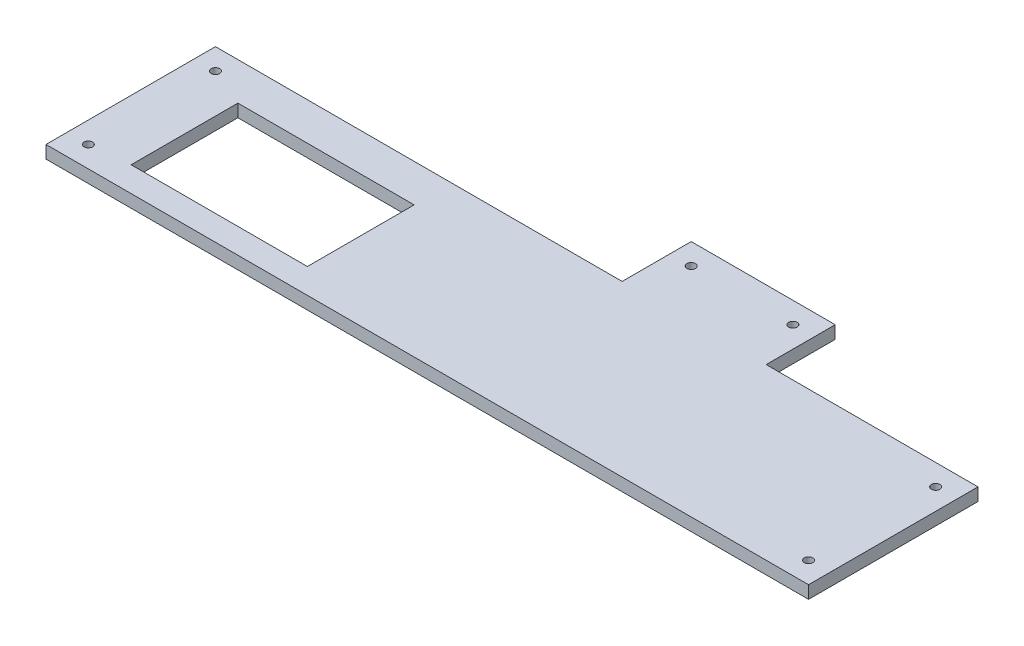
ISO-10303-21;
HEADER;
FILE_DESCRIPTION(('STEP AP214'),'2;1');
FILE_NAME('part.step','',(''),(''),'','','');
FILE_SCHEMA(('AUTOMOTIVE_DESIGN { 1 0 10303 214 1 1 1 1 }'));
ENDSEC;
DATA;
#1=APPLICATION_CONTEXT('core data for automotive mechanical design processes');
#2=APPLICATION_PROTOCOL_DEFINITION('international standard','automotive_design',2000,#1);
#3=PRODUCT_CONTEXT('',#1,'mechanical');
#4=PRODUCT('Part','Part','',(#3));
#5=PRODUCT_RELATED_PRODUCT_CATEGORY('part','',(#4));
#6=PRODUCT_DEFINITION_FORMATION('','',#4);
#7=PRODUCT_DEFINITION_CONTEXT('part definition',#1,'design');
#8=PRODUCT_DEFINITION('design','',#6,#7);
#9=PRODUCT_DEFINITION_SHAPE('','',#8);
#10=(LENGTH_UNIT() NAMED_UNIT(*) SI_UNIT(.MILLI.,.METRE.));
#11=(NAMED_UNIT(*) PLANE_ANGLE_UNIT() SI_UNIT($,.RADIAN.));
#12=(NAMED_UNIT(*) SI_UNIT($,.STERADIAN.) SOLID_ANGLE_UNIT());
#13=UNCERTAINTY_MEASURE_WITH_UNIT(LENGTH_MEASURE(1.E-05),#10,'distance_accuracy_value','');
#14=(GEOMETRIC_REPRESENTATION_CONTEXT(3) GLOBAL_UNCERTAINTY_ASSIGNED_CONTEXT((#13)) GLOBAL_UNIT_ASSIGNED_CONTEXT((#10,
#11,#12)) REPRESENTATION_CONTEXT('',''));
#15=CARTESIAN_POINT('',(0.,0.,0.));
#16=DIRECTION('',(0.,0.,1.));
#17=DIRECTION('',(1.,0.,0.));
#18=AXIS2_PLACEMENT_3D('',#15,#16,#17);
#19=CARTESIAN_POINT('',(450.,-15.,-100.000000000001));
#20=DIRECTION('',(0.,0.,-1.));
#21=DIRECTION('',(-1.,0.,0.));
#22=AXIS2_PLACEMENT_3D('',#19,#20,#21);
#23=PLANE('',#22);
#24=DIRECTION('',(-1.,0.,0.));
#25=VECTOR('',#24,1.);
#26=CARTESIAN_POINT('',(450.,-15.,-100.000000000001));
#27=LINE('',#26,#25);
#28=CARTESIAN_POINT('',(450.,-15.,-100.000000000001));
#29=VERTEX_POINT('',#28);
#30=CARTESIAN_POINT('',(200.,-15.,-100.000000000001));
#31=VERTEX_POINT('',#30);
#32=EDGE_CURVE('E224',#29,#31,#27,.T.);
#33=ORIENTED_EDGE('',*,*,#32,.T.);
#34=DIRECTION('',(0.,1.,0.));
#35=VECTOR('',#34,1.);
#36=CARTESIAN_POINT('',(200.,-15.,-100.000000000001));
#37=LINE('',#36,#35);
#38=CARTESIAN_POINT('',(200.,0.,-100.000000000001));
#39=VERTEX_POINT('',#38);
#40=EDGE_CURVE('E147',#31,#39,#37,.T.);
#41=ORIENTED_EDGE('',*,*,#40,.T.);
#42=DIRECTION('',(-1.,0.,0.));
#43=VECTOR('',#42,1.);
#44=CARTESIAN_POINT('',(450.,0.,-100.000000000001));
#45=LINE('',#44,#43);
#46=CARTESIAN_POINT('',(450.,0.,-100.000000000001));
#47=VERTEX_POINT('',#46);
#48=EDGE_CURVE('E235',#47,#39,#45,.T.);
#49=ORIENTED_EDGE('',*,*,#48,.F.);
#50=DIRECTION('',(0.,1.,0.));
#51=VECTOR('',#50,1.);
#52=CARTESIAN_POINT('',(450.,-15.,-100.000000000001));
#53=LINE('',#52,#51);
#54=EDGE_CURVE('E39',#29,#47,#53,.T.);
#55=ORIENTED_EDGE('',*,*,#54,.F.);
#56=EDGE_LOOP('',(#33,#41,#49,#55));
#57=FACE_BOUND('',#56,.T.);
#58=ADVANCED_FACE('F35',(#57),#23,.T.);
#59=CARTESIAN_POINT('',(450.,-15.,100.000000000001));
#60=DIRECTION('',(1.,0.,0.));
#61=DIRECTION('',(0.,0.,-1.));
#62=AXIS2_PLACEMENT_3D('',#59,#60,#61);
#63=PLANE('',#62);
#64=DIRECTION('',(0.,0.,-1.));
#65=VECTOR('',#64,1.);
#66=CARTESIAN_POINT('',(450.,0.,100.000000000001));
#67=LINE('',#66,#65);
#68=CARTESIAN_POINT('',(450.,0.,100.000000000001));
#69=VERTEX_POINT('',#68);
#70=EDGE_CURVE('E216',#69,#47,#67,.T.);
#71=ORIENTED_EDGE('',*,*,#70,.F.);
#72=DIRECTION('',(0.,1.,0.));
#73=VECTOR('',#72,1.);
#74=CARTESIAN_POINT('',(450.,-15.,100.000000000001));
#75=LINE('',#74,#73);
#76=CARTESIAN_POINT('',(450.,-15.,100.000000000001));
#77=VERTEX_POINT('',#76);
#78=EDGE_CURVE('E11',#77,#69,#75,.T.);
#79=ORIENTED_EDGE('',*,*,#78,.F.);
#80=DIRECTION('',(0.,0.,-1.));
#81=VECTOR('',#80,1.);
#82=CARTESIAN_POINT('',(450.,-15.,100.000000000001));
#83=LINE('',#82,#81);
#84=EDGE_CURVE('E219',#77,#29,#83,.T.);
#85=ORIENTED_EDGE('',*,*,#84,.T.);
#86=ORIENTED_EDGE('',*,*,#54,.T.);
#87=EDGE_LOOP('',(#71,#79,#85,#86));
#88=FACE_BOUND('',#87,.T.);
#89=ADVANCED_FACE('F37',(#88),#63,.T.);
#90=CARTESIAN_POINT('',(-450.,-15.,100.000000000001));
#91=DIRECTION('',(0.,0.,1.));
#92=DIRECTION('',(1.,0.,0.));
#93=AXIS2_PLACEMENT_3D('',#90,#91,#92);
#94=PLANE('',#93);
#95=DIRECTION('',(1.,0.,0.));
#96=VECTOR('',#95,1.);
#97=CARTESIAN_POINT('',(-450.,0.,100.000000000001));
#98=LINE('',#97,#96);
#99=CARTESIAN_POINT('',(-450.,0.,100.000000000001));
#100=VERTEX_POINT('',#99);
#101=EDGE_CURVE('E223',#100,#69,#98,.T.);
#102=ORIENTED_EDGE('',*,*,#101,.F.);
#103=DIRECTION('',(0.,1.,0.));
#104=VECTOR('',#103,1.);
#105=CARTESIAN_POINT('',(-450.,-15.,100.000000000001));
#106=LINE('',#105,#104);
#107=CARTESIAN_POINT('',(-450.,-15.,100.000000000001));
#108=VERTEX_POINT('',#107);
#109=EDGE_CURVE('E44',#108,#100,#106,.T.);
#110=ORIENTED_EDGE('',*,*,#109,.F.);
#111=DIRECTION('',(1.,0.,0.));
#112=VECTOR('',#111,1.);
#113=CARTESIAN_POINT('',(-450.,-15.,100.000000000001));
#114=LINE('',#113,#112);
#115=EDGE_CURVE('E229',#108,#77,#114,.T.);
#116=ORIENTED_EDGE('',*,*,#115,.T.);
#117=ORIENTED_EDGE('',*,*,#78,.T.);
#118=EDGE_LOOP('',(#102,#110,#116,#117));
#119=FACE_BOUND('',#118,.T.);
#120=ADVANCED_FACE('F258',(#119),#94,.T.);
#121=CARTESIAN_POINT('',(-450.,-15.,-100.));
#122=DIRECTION('',(-1.,0.,0.));
#123=DIRECTION('',(0.,0.,1.));
#124=AXIS2_PLACEMENT_3D('',#121,#122,#123);
#125=PLANE('',#124);
#126=DIRECTION('',(0.,0.,1.));
#127=VECTOR('',#126,1.);
#128=CARTESIAN_POINT('',(-450.,0.,-100.));
#129=LINE('',#128,#127);
#130=CARTESIAN_POINT('',(-450.,0.,-100.));
#131=VERTEX_POINT('',#130);
#132=EDGE_CURVE('E238',#131,#100,#129,.T.);
#133=ORIENTED_EDGE('',*,*,#132,.F.);
#134=DIRECTION('',(0.,1.,0.));
#135=VECTOR('',#134,1.);
#136=CARTESIAN_POINT('',(-450.,-15.,-100.));
#137=LINE('',#136,#135);
#138=CARTESIAN_POINT('',(-450.,-15.,-100.));
#139=VERTEX_POINT('',#138);
#140=EDGE_CURVE('E243',#139,#131,#137,.T.);
#141=ORIENTED_EDGE('',*,*,#140,.F.);
#142=DIRECTION('',(0.,0.,1.));
#143=VECTOR('',#142,1.);
#144=CARTESIAN_POINT('',(-450.,-15.,-100.));
#145=LINE('',#144,#143);
#146=EDGE_CURVE('E226',#139,#108,#145,.T.);
#147=ORIENTED_EDGE('',*,*,#146,.T.);
#148=ORIENTED_EDGE('',*,*,#109,.T.);
#149=EDGE_LOOP('',(#133,#141,#147,#148));
#150=FACE_BOUND('',#149,.T.);
#151=ADVANCED_FACE('F262',(#150),#125,.T.);
#152=DIRECTION('',(0.,1.,0.));
#153=VECTOR('',#152,1.);
#154=CARTESIAN_POINT('',(30.,-15.,-100.000000000001));
#155=LINE('',#154,#153);
#156=CARTESIAN_POINT('',(30.,-15.,-100.000000000001));
#157=VERTEX_POINT('',#156);
#158=CARTESIAN_POINT('',(30.,0.,-100.000000000001));
#159=VERTEX_POINT('',#158);
#160=EDGE_CURVE('E161',#157,#159,#155,.T.);
#161=ORIENTED_EDGE('',*,*,#160,.F.);
#162=EDGE_CURVE('E222',#157,#139,#27,.T.);
#163=ORIENTED_EDGE('',*,*,#162,.T.);
#164=ORIENTED_EDGE('',*,*,#140,.T.);
#165=EDGE_CURVE('E234',#159,#131,#45,.T.);
#166=ORIENTED_EDGE('',*,*,#165,.F.);
#167=EDGE_LOOP('',(#161,#163,#164,#166));
#168=FACE_BOUND('',#167,.T.);
#169=ADVANCED_FACE('F264',(#168),#23,.T.);
#170=CARTESIAN_POINT('',(0.,-15.,0.));
#171=DIRECTION('',(0.,1.,0.));
#172=DIRECTION('',(0.,0.,1.));
#173=AXIS2_PLACEMENT_3D('',#170,#171,#172);
#174=PLANE('',#173);
#175=DIRECTION('',(1.,0.,0.));
#176=VECTOR('',#175,1.);
#177=CARTESIAN_POINT('',(-379.,-15.,-55.5000000000002));
#178=LINE('',#177,#176);
#179=CARTESIAN_POINT('',(-379.,-15.,-55.5000000000002));
#180=VERTEX_POINT('',#179);
#181=CARTESIAN_POINT('',(-171.,-15.,-55.5000000000002));
#182=VERTEX_POINT('',#181);
#183=EDGE_CURVE('E179',#180,#182,#178,.T.);
#184=ORIENTED_EDGE('',*,*,#183,.F.);
#185=DIRECTION('',(0.,0.,-1.));
#186=VECTOR('',#185,1.);
#187=CARTESIAN_POINT('',(-379.,-15.,70.5));
#188=LINE('',#187,#186);
#189=CARTESIAN_POINT('',(-379.,-15.,70.5));
#190=VERTEX_POINT('',#189);
#191=EDGE_CURVE('E60',#190,#180,#188,.T.);
#192=ORIENTED_EDGE('',*,*,#191,.F.);
#193=DIRECTION('',(-1.,0.,0.));
#194=VECTOR('',#193,1.);
#195=CARTESIAN_POINT('',(-379.,-15.,70.5));
#196=LINE('',#195,#194);
#197=CARTESIAN_POINT('',(-171.,-15.,70.5));
#198=VERTEX_POINT('',#197);
#199=EDGE_CURVE('E168',#198,#190,#196,.T.);
#200=ORIENTED_EDGE('',*,*,#199,.F.);
#201=DIRECTION('',(0.,0.,1.));
#202=VECTOR('',#201,1.);
#203=CARTESIAN_POINT('',(-171.,-15.,70.5));
#204=LINE('',#203,#202);
#205=EDGE_CURVE('E182',#182,#198,#204,.T.);
#206=ORIENTED_EDGE('',*,*,#205,.F.);
#207=EDGE_LOOP('',(#184,#192,#200,#206));
#208=FACE_BOUND('',#207,.T.);
#209=CARTESIAN_POINT('',(-425.,-15.,-75.0000000000004));
#210=DIRECTION('',(0.,1.,0.));
#211=DIRECTION('',(0.,0.,1.));
#212=AXIS2_PLACEMENT_3D('',#209,#210,#211);
#213=CIRCLE('',#212,4.99999999999999);
#214=CARTESIAN_POINT('',(-425.,-15.,-70.0000000000004));
#215=VERTEX_POINT('',#214);
#216=EDGE_CURVE('E195',#215,#215,#213,.T.);
#217=ORIENTED_EDGE('',*,*,#216,.T.);
#218=EDGE_LOOP('',(#217));
#219=FACE_BOUND('',#218,.T.);
#220=CARTESIAN_POINT('',(-425.,-15.,75.000000000001));
#221=DIRECTION('',(0.,1.,0.));
#222=DIRECTION('',(0.,0.,1.));
#223=AXIS2_PLACEMENT_3D('',#220,#221,#222);
#224=CIRCLE('',#223,4.99999999999999);
#225=CARTESIAN_POINT('',(-425.,-15.,80.000000000001));
#226=VERTEX_POINT('',#225);
#227=EDGE_CURVE('E201',#226,#226,#224,.T.);
#228=ORIENTED_EDGE('',*,*,#227,.T.);
#229=EDGE_LOOP('',(#228));
#230=FACE_BOUND('',#229,.T.);
#231=CARTESIAN_POINT('',(425.,-15.,-75.000000000001));
#232=DIRECTION('',(0.,1.,0.));
#233=DIRECTION('',(0.,0.,1.));
#234=AXIS2_PLACEMENT_3D('',#231,#232,#233);
#235=CIRCLE('',#234,4.99999999999999);
#236=CARTESIAN_POINT('',(425.,-15.,-70.000000000001));
#237=VERTEX_POINT('',#236);
#238=EDGE_CURVE('E207',#237,#237,#235,.T.);
#239=ORIENTED_EDGE('',*,*,#238,.T.);
#240=EDGE_LOOP('',(#239));
#241=FACE_BOUND('',#240,.T.);
#242=CARTESIAN_POINT('',(425.,-15.,75.000000000001));
#243=DIRECTION('',(0.,1.,0.));
#244=DIRECTION('',(0.,0.,1.));
#245=AXIS2_PLACEMENT_3D('',#242,#243,#244);
#246=CIRCLE('',#245,4.99999999999999);
#247=CARTESIAN_POINT('',(425.,-15.,80.000000000001));
#248=VERTEX_POINT('',#247);
#249=EDGE_CURVE('E213',#248,#248,#246,.T.);
#250=ORIENTED_EDGE('',*,*,#249,.T.);
#251=EDGE_LOOP('',(#250));
#252=FACE_BOUND('',#251,.T.);
#253=ORIENTED_EDGE('',*,*,#84,.F.);
#254=ORIENTED_EDGE('',*,*,#115,.F.);
#255=ORIENTED_EDGE('',*,*,#146,.F.);
#256=ORIENTED_EDGE('',*,*,#162,.F.);
#257=DIRECTION('',(0.,0.,1.));
#258=VECTOR('',#257,1.);
#259=CARTESIAN_POINT('',(30.,-15.,-100.000000000001));
#260=LINE('',#259,#258);
#261=CARTESIAN_POINT('',(30.,-15.,-181.5));
#262=VERTEX_POINT('',#261);
#263=EDGE_CURVE('E133',#262,#157,#260,.T.);
#264=ORIENTED_EDGE('',*,*,#263,.F.);
#265=DIRECTION('',(-1.,0.,0.));
#266=VECTOR('',#265,1.);
#267=CARTESIAN_POINT('',(200.,-15.,-181.5));
#268=LINE('',#267,#266);
#269=CARTESIAN_POINT('',(200.,-15.,-181.5));
#270=VERTEX_POINT('',#269);
#271=EDGE_CURVE('E128',#270,#262,#268,.T.);
#272=ORIENTED_EDGE('',*,*,#271,.F.);
#273=DIRECTION('',(0.,0.,-1.));
#274=VECTOR('',#273,1.);
#275=CARTESIAN_POINT('',(200.,-15.,-100.000000000001));
#276=LINE('',#275,#274);
#277=EDGE_CURVE('E142',#31,#270,#276,.T.);
#278=ORIENTED_EDGE('',*,*,#277,.F.);
#279=ORIENTED_EDGE('',*,*,#32,.F.);
#280=EDGE_LOOP('',(#253,#254,#255,#256,#264,#272,#278,#279));
#281=FACE_BOUND('',#280,.T.);
#282=CARTESIAN_POINT('',(54.9999999999999,-15.,-156.5));
#283=DIRECTION('',(0.,1.,0.));
#284=DIRECTION('',(0.,0.,-1.));
#285=AXIS2_PLACEMENT_3D('',#282,#283,#284);
#286=CIRCLE('',#285,4.99999999999999);
#287=CARTESIAN_POINT('',(54.9999999999999,-15.,-161.5));
#288=VERTEX_POINT('',#287);
#289=EDGE_CURVE('E447',#288,#288,#286,.T.);
#290=ORIENTED_EDGE('',*,*,#289,.T.);
#291=EDGE_LOOP('',(#290));
#292=FACE_BOUND('',#291,.T.);
#293=CARTESIAN_POINT('',(175.,-15.,-156.5));
#294=DIRECTION('',(0.,1.,0.));
#295=DIRECTION('',(0.,0.,1.));
#296=AXIS2_PLACEMENT_3D('',#293,#294,#295);
#297=CIRCLE('',#296,4.99999999999999);
#298=CARTESIAN_POINT('',(175.,-15.,-151.5));
#299=VERTEX_POINT('',#298);
#300=EDGE_CURVE('E158',#299,#299,#297,.T.);
#301=ORIENTED_EDGE('',*,*,#300,.T.);
#302=EDGE_LOOP('',(#301));
#303=FACE_BOUND('',#302,.T.);
#304=ADVANCED_FACE('F139',(#208,#219,#230,#241,#252,#281,#292,#303),#174,.F.);
#305=CARTESIAN_POINT('',(0.,0.,0.));
#306=DIRECTION('',(0.,1.,0.));
#307=DIRECTION('',(0.,0.,1.));
#308=AXIS2_PLACEMENT_3D('',#305,#306,#307);
#309=PLANE('',#308);
#310=DIRECTION('',(0.,0.,-1.));
#311=VECTOR('',#310,1.);
#312=CARTESIAN_POINT('',(-379.,0.,70.5));
#313=LINE('',#312,#311);
#314=CARTESIAN_POINT('',(-379.,0.,70.5));
#315=VERTEX_POINT('',#314);
#316=CARTESIAN_POINT('',(-379.,0.,-55.5000000000002));
#317=VERTEX_POINT('',#316);
#318=EDGE_CURVE('E164',#315,#317,#313,.T.);
#319=ORIENTED_EDGE('',*,*,#318,.T.);
#320=DIRECTION('',(1.,0.,0.));
#321=VECTOR('',#320,1.);
#322=CARTESIAN_POINT('',(-379.,0.,-55.5000000000002));
#323=LINE('',#322,#321);
#324=CARTESIAN_POINT('',(-171.,0.,-55.5000000000002));
#325=VERTEX_POINT('',#324);
#326=EDGE_CURVE('E167',#317,#325,#323,.T.);
#327=ORIENTED_EDGE('',*,*,#326,.T.);
#328=DIRECTION('',(0.,0.,1.));
#329=VECTOR('',#328,1.);
#330=CARTESIAN_POINT('',(-171.,0.,70.5));
#331=LINE('',#330,#329);
#332=CARTESIAN_POINT('',(-171.,0.,70.5));
#333=VERTEX_POINT('',#332);
#334=EDGE_CURVE('E171',#325,#333,#331,.T.);
#335=ORIENTED_EDGE('',*,*,#334,.T.);
#336=DIRECTION('',(-1.,0.,0.));
#337=VECTOR('',#336,1.);
#338=CARTESIAN_POINT('',(-379.,0.,70.5));
#339=LINE('',#338,#337);
#340=EDGE_CURVE('E174',#333,#315,#339,.T.);
#341=ORIENTED_EDGE('',*,*,#340,.T.);
#342=EDGE_LOOP('',(#319,#327,#335,#341));
#343=FACE_BOUND('',#342,.T.);
#344=CARTESIAN_POINT('',(-425.,0.,-75.0000000000004));
#345=DIRECTION('',(0.,1.,0.));
#346=DIRECTION('',(0.,0.,1.));
#347=AXIS2_PLACEMENT_3D('',#344,#345,#346);
#348=CIRCLE('',#347,4.99999999999999);
#349=CARTESIAN_POINT('',(-425.,0.,-70.0000000000004));
#350=VERTEX_POINT('',#349);
#351=EDGE_CURVE('E189',#350,#350,#348,.T.);
#352=ORIENTED_EDGE('',*,*,#351,.F.);
#353=EDGE_LOOP('',(#352));
#354=FACE_BOUND('',#353,.T.);
#355=CARTESIAN_POINT('',(-425.,0.,75.000000000001));
#356=DIRECTION('',(0.,1.,0.));
#357=DIRECTION('',(0.,0.,1.));
#358=AXIS2_PLACEMENT_3D('',#355,#356,#357);
#359=CIRCLE('',#358,4.99999999999999);
#360=CARTESIAN_POINT('',(-425.,0.,80.000000000001));
#361=VERTEX_POINT('',#360);
#362=EDGE_CURVE('E198',#361,#361,#359,.T.);
#363=ORIENTED_EDGE('',*,*,#362,.F.);
#364=EDGE_LOOP('',(#363));
#365=FACE_BOUND('',#364,.T.);
#366=CARTESIAN_POINT('',(425.,0.,-75.000000000001));
#367=DIRECTION('',(0.,1.,0.));
#368=DIRECTION('',(0.,0.,1.));
#369=AXIS2_PLACEMENT_3D('',#366,#367,#368);
#370=CIRCLE('',#369,4.99999999999999);
#371=CARTESIAN_POINT('',(425.,0.,-70.000000000001));
#372=VERTEX_POINT('',#371);
#373=EDGE_CURVE('E204',#372,#372,#370,.T.);
#374=ORIENTED_EDGE('',*,*,#373,.F.);
#375=EDGE_LOOP('',(#374));
#376=FACE_BOUND('',#375,.T.);
#377=CARTESIAN_POINT('',(425.,0.,75.000000000001));
#378=DIRECTION('',(0.,1.,0.));
#379=DIRECTION('',(0.,0.,1.));
#380=AXIS2_PLACEMENT_3D('',#377,#378,#379);
#381=CIRCLE('',#380,4.99999999999999);
#382=CARTESIAN_POINT('',(425.,0.,80.000000000001));
#383=VERTEX_POINT('',#382);
#384=EDGE_CURVE('E210',#383,#383,#381,.T.);
#385=ORIENTED_EDGE('',*,*,#384,.F.);
#386=EDGE_LOOP('',(#385));
#387=FACE_BOUND('',#386,.T.);
#388=ORIENTED_EDGE('',*,*,#70,.T.);
#389=ORIENTED_EDGE('',*,*,#48,.T.);
#390=DIRECTION('',(0.,0.,-1.));
#391=VECTOR('',#390,1.);
#392=CARTESIAN_POINT('',(200.,0.,-100.000000000001));
#393=LINE('',#392,#391);
#394=CARTESIAN_POINT('',(200.,0.,-181.5));
#395=VERTEX_POINT('',#394);
#396=EDGE_CURVE('E52',#39,#395,#393,.T.);
#397=ORIENTED_EDGE('',*,*,#396,.T.);
#398=DIRECTION('',(-1.,0.,0.));
#399=VECTOR('',#398,1.);
#400=CARTESIAN_POINT('',(200.,0.,-181.5));
#401=LINE('',#400,#399);
#402=CARTESIAN_POINT('',(30.,0.,-181.5));
#403=VERTEX_POINT('',#402);
#404=EDGE_CURVE('E130',#395,#403,#401,.T.);
#405=ORIENTED_EDGE('',*,*,#404,.T.);
#406=DIRECTION('',(0.,0.,1.));
#407=VECTOR('',#406,1.);
#408=CARTESIAN_POINT('',(30.,0.,-100.000000000001));
#409=LINE('',#408,#407);
#410=EDGE_CURVE('E148',#403,#159,#409,.T.);
#411=ORIENTED_EDGE('',*,*,#410,.T.);
#412=ORIENTED_EDGE('',*,*,#165,.T.);
#413=ORIENTED_EDGE('',*,*,#132,.T.);
#414=ORIENTED_EDGE('',*,*,#101,.T.);
#415=EDGE_LOOP('',(#388,#389,#397,#405,#411,#412,#413,#414));
#416=FACE_BOUND('',#415,.T.);
#417=CARTESIAN_POINT('',(54.9999999999999,0.,-156.5));
#418=DIRECTION('',(0.,1.,0.));
#419=DIRECTION('',(0.,0.,-1.));
#420=AXIS2_PLACEMENT_3D('',#417,#418,#419);
#421=CIRCLE('',#420,4.99999999999999);
#422=CARTESIAN_POINT('',(54.9999999999999,0.,-161.5));
#423=VERTEX_POINT('',#422);
#424=EDGE_CURVE('E450',#423,#423,#421,.T.);
#425=ORIENTED_EDGE('',*,*,#424,.F.);
#426=EDGE_LOOP('',(#425));
#427=FACE_BOUND('',#426,.T.);
#428=CARTESIAN_POINT('',(175.,0.,-156.5));
#429=DIRECTION('',(0.,1.,0.));
#430=DIRECTION('',(0.,0.,1.));
#431=AXIS2_PLACEMENT_3D('',#428,#429,#430);
#432=CIRCLE('',#431,4.99999999999999);
#433=CARTESIAN_POINT('',(175.,0.,-151.5));
#434=VERTEX_POINT('',#433);
#435=EDGE_CURVE('E153',#434,#434,#432,.T.);
#436=ORIENTED_EDGE('',*,*,#435,.F.);
#437=EDGE_LOOP('',(#436));
#438=FACE_BOUND('',#437,.T.);
#439=ADVANCED_FACE('F254',(#343,#354,#365,#376,#387,#416,#427,#438),#309,.T.);
#440=CARTESIAN_POINT('',(425.,-15.,75.000000000001));
#441=DIRECTION('',(0.,1.,0.));
#442=DIRECTION('',(0.,0.,1.));
#443=AXIS2_PLACEMENT_3D('',#440,#441,#442);
#444=CYLINDRICAL_SURFACE('',#443,4.99999999999999);
#445=ORIENTED_EDGE('',*,*,#249,.F.);
#446=EDGE_LOOP('',(#445));
#447=FACE_BOUND('',#446,.T.);
#448=ORIENTED_EDGE('',*,*,#384,.T.);
#449=EDGE_LOOP('',(#448));
#450=FACE_BOUND('',#449,.T.);
#451=ADVANCED_FACE('F291',(#447,#450),#444,.F.);
#452=CARTESIAN_POINT('',(425.,-15.,-75.000000000001));
#453=DIRECTION('',(0.,1.,0.));
#454=DIRECTION('',(0.,0.,1.));
#455=AXIS2_PLACEMENT_3D('',#452,#453,#454);
#456=CYLINDRICAL_SURFACE('',#455,4.99999999999999);
#457=ORIENTED_EDGE('',*,*,#238,.F.);
#458=EDGE_LOOP('',(#457));
#459=FACE_BOUND('',#458,.T.);
#460=ORIENTED_EDGE('',*,*,#373,.T.);
#461=EDGE_LOOP('',(#460));
#462=FACE_BOUND('',#461,.T.);
#463=ADVANCED_FACE('F296',(#459,#462),#456,.F.);
#464=CARTESIAN_POINT('',(-425.,-15.,75.000000000001));
#465=DIRECTION('',(0.,1.,0.));
#466=DIRECTION('',(0.,0.,1.));
#467=AXIS2_PLACEMENT_3D('',#464,#465,#466);
#468=CYLINDRICAL_SURFACE('',#467,4.99999999999999);
#469=ORIENTED_EDGE('',*,*,#227,.F.);
#470=EDGE_LOOP('',(#469));
#471=FACE_BOUND('',#470,.T.);
#472=ORIENTED_EDGE('',*,*,#362,.T.);
#473=EDGE_LOOP('',(#472));
#474=FACE_BOUND('',#473,.T.);
#475=ADVANCED_FACE('F308',(#471,#474),#468,.F.);
#476=CARTESIAN_POINT('',(-425.,-15.,-75.0000000000004));
#477=DIRECTION('',(0.,1.,0.));
#478=DIRECTION('',(0.,0.,1.));
#479=AXIS2_PLACEMENT_3D('',#476,#477,#478);
#480=CYLINDRICAL_SURFACE('',#479,4.99999999999999);
#481=ORIENTED_EDGE('',*,*,#216,.F.);
#482=EDGE_LOOP('',(#481));
#483=FACE_BOUND('',#482,.T.);
#484=ORIENTED_EDGE('',*,*,#351,.T.);
#485=EDGE_LOOP('',(#484));
#486=FACE_BOUND('',#485,.T.);
#487=ADVANCED_FACE('F318',(#483,#486),#480,.F.);
#488=CARTESIAN_POINT('',(-379.,0.,70.5));
#489=DIRECTION('',(-1.,0.,0.));
#490=DIRECTION('',(0.,0.,1.));
#491=AXIS2_PLACEMENT_3D('',#488,#489,#490);
#492=PLANE('',#491);
#493=ORIENTED_EDGE('',*,*,#191,.T.);
#494=DIRECTION('',(0.,-1.,0.));
#495=VECTOR('',#494,1.);
#496=CARTESIAN_POINT('',(-379.,0.,-55.5000000000002));
#497=LINE('',#496,#495);
#498=EDGE_CURVE('E177',#317,#180,#497,.T.);
#499=ORIENTED_EDGE('',*,*,#498,.F.);
#500=ORIENTED_EDGE('',*,*,#318,.F.);
#501=DIRECTION('',(0.,-1.,0.));
#502=VECTOR('',#501,1.);
#503=CARTESIAN_POINT('',(-379.,0.,70.5));
#504=LINE('',#503,#502);
#505=EDGE_CURVE('E187',#315,#190,#504,.T.);
#506=ORIENTED_EDGE('',*,*,#505,.T.);
#507=EDGE_LOOP('',(#493,#499,#500,#506));
#508=FACE_BOUND('',#507,.T.);
#509=ADVANCED_FACE('F328',(#508),#492,.F.);
#510=CARTESIAN_POINT('',(-379.,0.,70.5));
#511=DIRECTION('',(0.,0.,1.));
#512=DIRECTION('',(1.,0.,0.));
#513=AXIS2_PLACEMENT_3D('',#510,#511,#512);
#514=PLANE('',#513);
#515=ORIENTED_EDGE('',*,*,#199,.T.);
#516=ORIENTED_EDGE('',*,*,#505,.F.);
#517=ORIENTED_EDGE('',*,*,#340,.F.);
#518=DIRECTION('',(0.,-1.,0.));
#519=VECTOR('',#518,1.);
#520=CARTESIAN_POINT('',(-171.,0.,70.5));
#521=LINE('',#520,#519);
#522=EDGE_CURVE('E190',#333,#198,#521,.T.);
#523=ORIENTED_EDGE('',*,*,#522,.T.);
#524=EDGE_LOOP('',(#515,#516,#517,#523));
#525=FACE_BOUND('',#524,.T.);
#526=ADVANCED_FACE('F338',(#525),#514,.F.);
#527=CARTESIAN_POINT('',(-171.,0.,70.5));
#528=DIRECTION('',(1.,0.,0.));
#529=DIRECTION('',(0.,0.,-1.));
#530=AXIS2_PLACEMENT_3D('',#527,#528,#529);
#531=PLANE('',#530);
#532=ORIENTED_EDGE('',*,*,#205,.T.);
#533=ORIENTED_EDGE('',*,*,#522,.F.);
#534=ORIENTED_EDGE('',*,*,#334,.F.);
#535=DIRECTION('',(0.,-1.,0.));
#536=VECTOR('',#535,1.);
#537=CARTESIAN_POINT('',(-171.,0.,-55.5000000000002));
#538=LINE('',#537,#536);
#539=EDGE_CURVE('E192',#325,#182,#538,.T.);
#540=ORIENTED_EDGE('',*,*,#539,.T.);
#541=EDGE_LOOP('',(#532,#533,#534,#540));
#542=FACE_BOUND('',#541,.T.);
#543=ADVANCED_FACE('F347',(#542),#531,.F.);
#544=CARTESIAN_POINT('',(-379.,0.,-55.5000000000002));
#545=DIRECTION('',(0.,0.,-1.));
#546=DIRECTION('',(-1.,0.,0.));
#547=AXIS2_PLACEMENT_3D('',#544,#545,#546);
#548=PLANE('',#547);
#549=ORIENTED_EDGE('',*,*,#183,.T.);
#550=ORIENTED_EDGE('',*,*,#539,.F.);
#551=ORIENTED_EDGE('',*,*,#326,.F.);
#552=ORIENTED_EDGE('',*,*,#498,.T.);
#553=EDGE_LOOP('',(#549,#550,#551,#552));
#554=FACE_BOUND('',#553,.T.);
#555=ADVANCED_FACE('F357',(#554),#548,.F.);
#556=CARTESIAN_POINT('',(200.,-15.,-100.000000000001));
#557=DIRECTION('',(1.,0.,0.));
#558=DIRECTION('',(0.,0.,-1.));
#559=AXIS2_PLACEMENT_3D('',#556,#557,#558);
#560=PLANE('',#559);
#561=ORIENTED_EDGE('',*,*,#396,.F.);
#562=ORIENTED_EDGE('',*,*,#40,.F.);
#563=ORIENTED_EDGE('',*,*,#277,.T.);
#564=DIRECTION('',(0.,1.,0.));
#565=VECTOR('',#564,1.);
#566=CARTESIAN_POINT('',(200.,-15.,-181.5));
#567=LINE('',#566,#565);
#568=EDGE_CURVE('E125',#270,#395,#567,.T.);
#569=ORIENTED_EDGE('',*,*,#568,.T.);
#570=EDGE_LOOP('',(#561,#562,#563,#569));
#571=FACE_BOUND('',#570,.T.);
#572=ADVANCED_FACE('F146',(#571),#560,.T.);
#573=CARTESIAN_POINT('',(30.,-15.,-100.000000000001));
#574=DIRECTION('',(-1.,0.,0.));
#575=DIRECTION('',(0.,0.,1.));
#576=AXIS2_PLACEMENT_3D('',#573,#574,#575);
#577=PLANE('',#576);
#578=ORIENTED_EDGE('',*,*,#410,.F.);
#579=DIRECTION('',(0.,1.,0.));
#580=VECTOR('',#579,1.);
#581=CARTESIAN_POINT('',(30.,-15.,-181.5));
#582=LINE('',#581,#580);
#583=EDGE_CURVE('E132',#262,#403,#582,.T.);
#584=ORIENTED_EDGE('',*,*,#583,.F.);
#585=ORIENTED_EDGE('',*,*,#263,.T.);
#586=ORIENTED_EDGE('',*,*,#160,.T.);
#587=EDGE_LOOP('',(#578,#584,#585,#586));
#588=FACE_BOUND('',#587,.T.);
#589=ADVANCED_FACE('F403',(#588),#577,.T.);
#590=CARTESIAN_POINT('',(200.,-15.,-181.5));
#591=DIRECTION('',(0.,0.,-1.));
#592=DIRECTION('',(-1.,0.,0.));
#593=AXIS2_PLACEMENT_3D('',#590,#591,#592);
#594=PLANE('',#593);
#595=ORIENTED_EDGE('',*,*,#404,.F.);
#596=ORIENTED_EDGE('',*,*,#568,.F.);
#597=ORIENTED_EDGE('',*,*,#271,.T.);
#598=ORIENTED_EDGE('',*,*,#583,.T.);
#599=EDGE_LOOP('',(#595,#596,#597,#598));
#600=FACE_BOUND('',#599,.T.);
#601=ADVANCED_FACE('F127',(#600),#594,.T.);
#602=CARTESIAN_POINT('',(175.,-15.,-156.5));
#603=DIRECTION('',(0.,1.,0.));
#604=DIRECTION('',(0.,0.,1.));
#605=AXIS2_PLACEMENT_3D('',#602,#603,#604);
#606=CYLINDRICAL_SURFACE('',#605,4.99999999999999);
#607=ORIENTED_EDGE('',*,*,#300,.F.);
#608=EDGE_LOOP('',(#607));
#609=FACE_BOUND('',#608,.T.);
#610=ORIENTED_EDGE('',*,*,#435,.T.);
#611=EDGE_LOOP('',(#610));
#612=FACE_BOUND('',#611,.T.);
#613=ADVANCED_FACE('F421',(#609,#612),#606,.F.);
#614=CARTESIAN_POINT('',(54.9999999999999,-15.,-156.5));
#615=DIRECTION('',(0.,1.,0.));
#616=DIRECTION('',(0.,0.,1.));
#617=AXIS2_PLACEMENT_3D('',#614,#615,#616);
#618=CYLINDRICAL_SURFACE('',#617,4.99999999999999);
#619=ORIENTED_EDGE('',*,*,#289,.F.);
#620=EDGE_LOOP('',(#619));
#621=FACE_BOUND('',#620,.T.);
#622=ORIENTED_EDGE('',*,*,#424,.T.);
#623=EDGE_LOOP('',(#622));
#624=FACE_BOUND('',#623,.T.);
#625=ADVANCED_FACE('F430',(#621,#624),#618,.F.);
#626=CLOSED_SHELL('',(#58,#89,#120,#151,#169,#304,#439,#451,#463,#475,#487,#509,#526,#543,#555,
#572,#589,#601,#613,#625));
#627=MANIFOLD_SOLID_BREP('B2',#626);
#628=ADVANCED_BREP_SHAPE_REPRESENTATION('',(#18,#627),#14);
#629=SHAPE_DEFINITION_REPRESENTATION(#9,#628);
ENDSEC;
END-ISO-10303-21;
